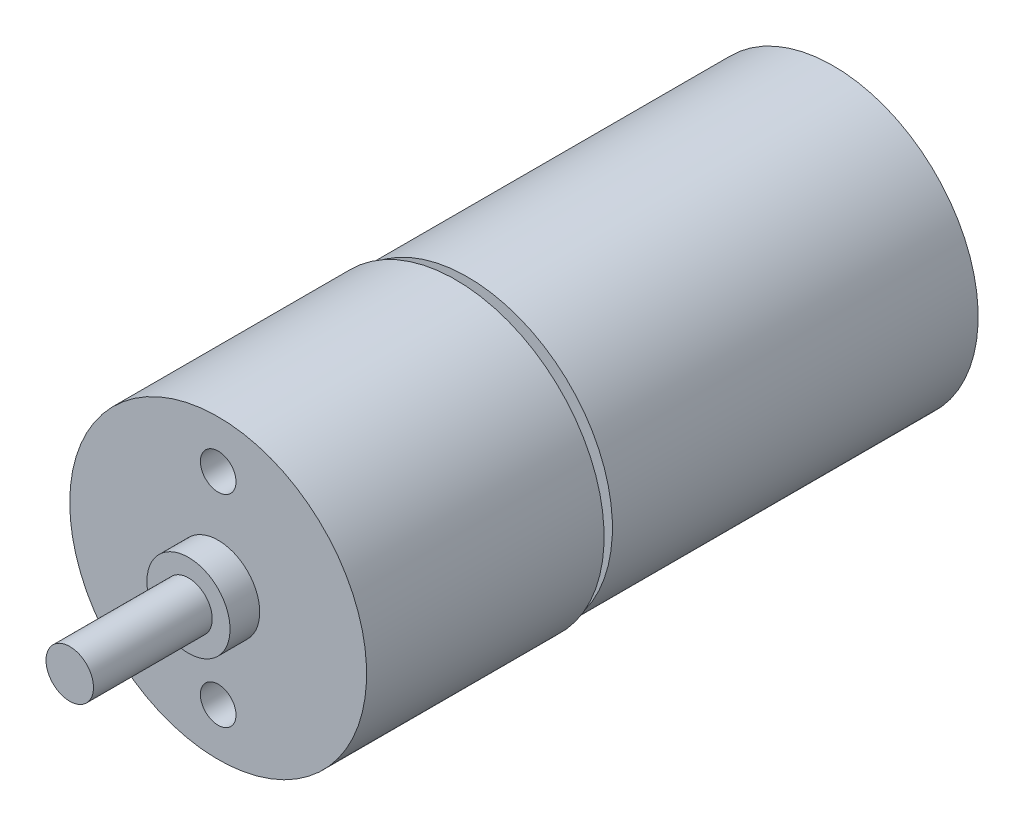
ISO-10303-21;
HEADER;
FILE_DESCRIPTION(('STEP AP214'),'2;1');
FILE_NAME('part.step','',(''),(''),'','','');
FILE_SCHEMA(('AUTOMOTIVE_DESIGN { 1 0 10303 214 1 1 1 1 }'));
ENDSEC;
DATA;
#1=APPLICATION_CONTEXT('core data for automotive mechanical design processes');
#2=APPLICATION_PROTOCOL_DEFINITION('international standard','automotive_design',2000,#1);
#3=PRODUCT_CONTEXT('',#1,'mechanical');
#4=PRODUCT('Part','Part','',(#3));
#5=PRODUCT_RELATED_PRODUCT_CATEGORY('part','',(#4));
#6=PRODUCT_DEFINITION_FORMATION('','',#4);
#7=PRODUCT_DEFINITION_CONTEXT('part definition',#1,'design');
#8=PRODUCT_DEFINITION('design','',#6,#7);
#9=PRODUCT_DEFINITION_SHAPE('','',#8);
#10=(LENGTH_UNIT() NAMED_UNIT(*) SI_UNIT(.MILLI.,.METRE.));
#11=(NAMED_UNIT(*) PLANE_ANGLE_UNIT() SI_UNIT($,.RADIAN.));
#12=(NAMED_UNIT(*) SI_UNIT($,.STERADIAN.) SOLID_ANGLE_UNIT());
#13=UNCERTAINTY_MEASURE_WITH_UNIT(LENGTH_MEASURE(1.E-05),#10,'distance_accuracy_value','');
#14=(GEOMETRIC_REPRESENTATION_CONTEXT(3) GLOBAL_UNCERTAINTY_ASSIGNED_CONTEXT((#13)) GLOBAL_UNIT_ASSIGNED_CONTEXT((#10,
#11,#12)) REPRESENTATION_CONTEXT('',''));
#15=CARTESIAN_POINT('',(0.,0.,0.));
#16=DIRECTION('',(0.,0.,1.));
#17=DIRECTION('',(1.,0.,0.));
#18=AXIS2_PLACEMENT_3D('',#15,#16,#17);
#19=CARTESIAN_POINT('',(0.,0.,64.3));
#20=DIRECTION('',(0.,0.,1.));
#21=DIRECTION('',(1.,0.,0.));
#22=AXIS2_PLACEMENT_3D('',#19,#20,#21);
#23=PLANE('',#22);
#24=CARTESIAN_POINT('',(0.,0.,64.3));
#25=DIRECTION('',(0.,0.,-1.));
#26=DIRECTION('',(-1.,0.,0.));
#27=AXIS2_PLACEMENT_3D('',#24,#25,#26);
#28=CIRCLE('',#27,2.);
#29=CARTESIAN_POINT('',(-2.,0.,64.3));
#30=VERTEX_POINT('',#29);
#31=EDGE_CURVE('E17',#30,#30,#28,.T.);
#32=ORIENTED_EDGE('',*,*,#31,.F.);
#33=EDGE_LOOP('',(#32));
#34=FACE_BOUND('',#33,.T.);
#35=ADVANCED_FACE('F14',(#34),#23,.T.);
#36=CARTESIAN_POINT('',(0.,0.,64.3));
#37=DIRECTION('',(0.,0.,-1.));
#38=DIRECTION('',(-1.,0.,0.));
#39=AXIS2_PLACEMENT_3D('',#36,#37,#38);
#40=CYLINDRICAL_SURFACE('',#39,2.);
#41=CARTESIAN_POINT('',(0.,0.,54.3));
#42=DIRECTION('',(0.,0.,-1.));
#43=DIRECTION('',(-1.,0.,0.));
#44=AXIS2_PLACEMENT_3D('',#41,#42,#43);
#45=CIRCLE('',#44,2.);
#46=CARTESIAN_POINT('',(-2.,0.,54.3));
#47=VERTEX_POINT('',#46);
#48=EDGE_CURVE('E57',#47,#47,#45,.T.);
#49=ORIENTED_EDGE('',*,*,#48,.F.);
#50=EDGE_LOOP('',(#49));
#51=FACE_BOUND('',#50,.T.);
#52=ORIENTED_EDGE('',*,*,#31,.T.);
#53=EDGE_LOOP('',(#52));
#54=FACE_BOUND('',#53,.T.);
#55=ADVANCED_FACE('F64',(#51,#54),#40,.T.);
#56=CARTESIAN_POINT('',(0.,8.5,39.8));
#57=DIRECTION('',(0.,0.,1.));
#58=DIRECTION('',(1.,0.,0.));
#59=AXIS2_PLACEMENT_3D('',#56,#57,#58);
#60=PLANE('',#59);
#61=CARTESIAN_POINT('',(0.,8.5,39.8));
#62=DIRECTION('',(0.,0.,1.));
#63=DIRECTION('',(1.,0.,0.));
#64=AXIS2_PLACEMENT_3D('',#61,#62,#63);
#65=CIRCLE('',#64,1.5);
#66=CARTESIAN_POINT('',(1.5,8.5,39.8));
#67=VERTEX_POINT('',#66);
#68=EDGE_CURVE('E55',#67,#67,#65,.T.);
#69=ORIENTED_EDGE('',*,*,#68,.T.);
#70=EDGE_LOOP('',(#69));
#71=FACE_BOUND('',#70,.T.);
#72=ADVANCED_FACE('F71',(#71),#60,.T.);
#73=CARTESIAN_POINT('',(0.,-8.5,39.8));
#74=DIRECTION('',(0.,0.,1.));
#75=DIRECTION('',(1.,0.,0.));
#76=AXIS2_PLACEMENT_3D('',#73,#74,#75);
#77=PLANE('',#76);
#78=CARTESIAN_POINT('',(0.,-8.5,39.8));
#79=DIRECTION('',(0.,0.,1.));
#80=DIRECTION('',(1.,0.,0.));
#81=AXIS2_PLACEMENT_3D('',#78,#79,#80);
#82=CIRCLE('',#81,1.5);
#83=CARTESIAN_POINT('',(1.5,-8.5,39.8));
#84=VERTEX_POINT('',#83);
#85=EDGE_CURVE('E52',#84,#84,#82,.T.);
#86=ORIENTED_EDGE('',*,*,#85,.T.);
#87=EDGE_LOOP('',(#86));
#88=FACE_BOUND('',#87,.T.);
#89=ADVANCED_FACE('F119',(#88),#77,.T.);
#90=CARTESIAN_POINT('',(0.,0.,54.3));
#91=DIRECTION('',(0.,0.,1.));
#92=DIRECTION('',(1.,0.,0.));
#93=AXIS2_PLACEMENT_3D('',#90,#91,#92);
#94=PLANE('',#93);
#95=ORIENTED_EDGE('',*,*,#48,.T.);
#96=EDGE_LOOP('',(#95));
#97=FACE_BOUND('',#96,.T.);
#98=CARTESIAN_POINT('',(0.,0.,54.3));
#99=DIRECTION('',(0.,0.,-1.));
#100=DIRECTION('',(-1.,0.,0.));
#101=AXIS2_PLACEMENT_3D('',#98,#99,#100);
#102=CIRCLE('',#101,3.5);
#103=CARTESIAN_POINT('',(-3.5,0.,54.3));
#104=VERTEX_POINT('',#103);
#105=EDGE_CURVE('E49',#104,#104,#102,.T.);
#106=ORIENTED_EDGE('',*,*,#105,.F.);
#107=EDGE_LOOP('',(#106));
#108=FACE_BOUND('',#107,.T.);
#109=ADVANCED_FACE('F115',(#97,#108),#94,.T.);
#110=CARTESIAN_POINT('',(0.,8.5,39.8));
#111=DIRECTION('',(0.,0.,1.));
#112=DIRECTION('',(1.,0.,0.));
#113=AXIS2_PLACEMENT_3D('',#110,#111,#112);
#114=CYLINDRICAL_SURFACE('',#113,1.5);
#115=CARTESIAN_POINT('',(0.,8.5,51.8));
#116=DIRECTION('',(0.,0.,1.));
#117=DIRECTION('',(1.,0.,0.));
#118=AXIS2_PLACEMENT_3D('',#115,#116,#117);
#119=CIRCLE('',#118,1.5);
#120=CARTESIAN_POINT('',(1.5,8.5,51.8));
#121=VERTEX_POINT('',#120);
#122=EDGE_CURVE('E46',#121,#121,#119,.F.);
#123=ORIENTED_EDGE('',*,*,#122,.F.);
#124=EDGE_LOOP('',(#123));
#125=FACE_BOUND('',#124,.T.);
#126=ORIENTED_EDGE('',*,*,#68,.F.);
#127=EDGE_LOOP('',(#126));
#128=FACE_BOUND('',#127,.T.);
#129=ADVANCED_FACE('F111',(#125,#128),#114,.F.);
#130=CARTESIAN_POINT('',(0.,-8.5,39.8));
#131=DIRECTION('',(0.,0.,1.));
#132=DIRECTION('',(1.,0.,0.));
#133=AXIS2_PLACEMENT_3D('',#130,#131,#132);
#134=CYLINDRICAL_SURFACE('',#133,1.5);
#135=CARTESIAN_POINT('',(0.,-8.5,51.8));
#136=DIRECTION('',(0.,0.,1.));
#137=DIRECTION('',(1.,0.,0.));
#138=AXIS2_PLACEMENT_3D('',#135,#136,#137);
#139=CIRCLE('',#138,1.5);
#140=CARTESIAN_POINT('',(1.5,-8.5,51.8));
#141=VERTEX_POINT('',#140);
#142=EDGE_CURVE('E43',#141,#141,#139,.F.);
#143=ORIENTED_EDGE('',*,*,#142,.F.);
#144=EDGE_LOOP('',(#143));
#145=FACE_BOUND('',#144,.T.);
#146=ORIENTED_EDGE('',*,*,#85,.F.);
#147=EDGE_LOOP('',(#146));
#148=FACE_BOUND('',#147,.T.);
#149=ADVANCED_FACE('F107',(#145,#148),#134,.F.);
#150=CARTESIAN_POINT('',(0.,0.,54.3));
#151=DIRECTION('',(0.,0.,-1.));
#152=DIRECTION('',(-1.,0.,0.));
#153=AXIS2_PLACEMENT_3D('',#150,#151,#152);
#154=CYLINDRICAL_SURFACE('',#153,3.5);
#155=CARTESIAN_POINT('',(0.,0.,51.8));
#156=DIRECTION('',(0.,0.,-1.));
#157=DIRECTION('',(-1.,0.,0.));
#158=AXIS2_PLACEMENT_3D('',#155,#156,#157);
#159=CIRCLE('',#158,3.5);
#160=CARTESIAN_POINT('',(-3.5,0.,51.8));
#161=VERTEX_POINT('',#160);
#162=EDGE_CURVE('E40',#161,#161,#159,.T.);
#163=ORIENTED_EDGE('',*,*,#162,.F.);
#164=EDGE_LOOP('',(#163));
#165=FACE_BOUND('',#164,.T.);
#166=ORIENTED_EDGE('',*,*,#105,.T.);
#167=EDGE_LOOP('',(#166));
#168=FACE_BOUND('',#167,.T.);
#169=ADVANCED_FACE('F103',(#165,#168),#154,.T.);
#170=CARTESIAN_POINT('',(0.,0.,51.8));
#171=DIRECTION('',(0.,0.,1.));
#172=DIRECTION('',(1.,0.,0.));
#173=AXIS2_PLACEMENT_3D('',#170,#171,#172);
#174=PLANE('',#173);
#175=ORIENTED_EDGE('',*,*,#162,.T.);
#176=EDGE_LOOP('',(#175));
#177=FACE_BOUND('',#176,.T.);
#178=ORIENTED_EDGE('',*,*,#142,.T.);
#179=EDGE_LOOP('',(#178));
#180=FACE_BOUND('',#179,.T.);
#181=ORIENTED_EDGE('',*,*,#122,.T.);
#182=EDGE_LOOP('',(#181));
#183=FACE_BOUND('',#182,.T.);
#184=CARTESIAN_POINT('',(0.,0.,51.8));
#185=DIRECTION('',(0.,0.,-1.));
#186=DIRECTION('',(-1.,0.,0.));
#187=AXIS2_PLACEMENT_3D('',#184,#185,#186);
#188=CIRCLE('',#187,12.5);
#189=CARTESIAN_POINT('',(-12.5,0.,51.8));
#190=VERTEX_POINT('',#189);
#191=EDGE_CURVE('E37',#190,#190,#188,.T.);
#192=ORIENTED_EDGE('',*,*,#191,.F.);
#193=EDGE_LOOP('',(#192));
#194=FACE_BOUND('',#193,.T.);
#195=ADVANCED_FACE('F99',(#177,#180,#183,#194),#174,.T.);
#196=CARTESIAN_POINT('',(0.,0.,51.8));
#197=DIRECTION('',(0.,0.,-1.));
#198=DIRECTION('',(-1.,0.,0.));
#199=AXIS2_PLACEMENT_3D('',#196,#197,#198);
#200=CYLINDRICAL_SURFACE('',#199,12.5);
#201=ORIENTED_EDGE('',*,*,#191,.T.);
#202=EDGE_LOOP('',(#201));
#203=FACE_BOUND('',#202,.T.);
#204=CARTESIAN_POINT('',(0.,0.,31.8));
#205=DIRECTION('',(0.,0.,-1.));
#206=DIRECTION('',(-1.,0.,0.));
#207=AXIS2_PLACEMENT_3D('',#204,#205,#206);
#208=CIRCLE('',#207,12.5);
#209=CARTESIAN_POINT('',(-12.5,0.,31.8));
#210=VERTEX_POINT('',#209);
#211=EDGE_CURVE('E34',#210,#210,#208,.F.);
#212=ORIENTED_EDGE('',*,*,#211,.T.);
#213=EDGE_LOOP('',(#212));
#214=FACE_BOUND('',#213,.T.);
#215=ADVANCED_FACE('F95',(#203,#214),#200,.T.);
#216=CARTESIAN_POINT('',(11.,0.,31.8));
#217=DIRECTION('',(0.,0.,1.));
#218=DIRECTION('',(1.,0.,0.));
#219=AXIS2_PLACEMENT_3D('',#216,#217,#218);
#220=PLANE('',#219);
#221=ORIENTED_EDGE('',*,*,#211,.F.);
#222=EDGE_LOOP('',(#221));
#223=FACE_BOUND('',#222,.T.);
#224=CARTESIAN_POINT('',(0.,0.,31.8));
#225=DIRECTION('',(0.,0.,1.));
#226=DIRECTION('',(1.,0.,0.));
#227=AXIS2_PLACEMENT_3D('',#224,#225,#226);
#228=CIRCLE('',#227,11.);
#229=CARTESIAN_POINT('',(11.,0.,31.8));
#230=VERTEX_POINT('',#229);
#231=EDGE_CURVE('E31',#230,#230,#228,.F.);
#232=ORIENTED_EDGE('',*,*,#231,.F.);
#233=EDGE_LOOP('',(#232));
#234=FACE_BOUND('',#233,.T.);
#235=ADVANCED_FACE('F91',(#223,#234),#220,.F.);
#236=CARTESIAN_POINT('',(0.,0.,51.8));
#237=DIRECTION('',(0.,0.,1.));
#238=DIRECTION('',(1.,0.,0.));
#239=AXIS2_PLACEMENT_3D('',#236,#237,#238);
#240=CYLINDRICAL_SURFACE('',#239,11.);
#241=ORIENTED_EDGE('',*,*,#231,.T.);
#242=EDGE_LOOP('',(#241));
#243=FACE_BOUND('',#242,.T.);
#244=CARTESIAN_POINT('',(0.,0.,30.8));
#245=DIRECTION('',(0.,0.,1.));
#246=DIRECTION('',(1.,0.,0.));
#247=AXIS2_PLACEMENT_3D('',#244,#245,#246);
#248=CIRCLE('',#247,11.);
#249=CARTESIAN_POINT('',(11.,0.,30.8));
#250=VERTEX_POINT('',#249);
#251=EDGE_CURVE('E26',#250,#250,#248,.T.);
#252=ORIENTED_EDGE('',*,*,#251,.T.);
#253=EDGE_LOOP('',(#252));
#254=FACE_BOUND('',#253,.T.);
#255=ADVANCED_FACE('F87',(#243,#254),#240,.T.);
#256=CARTESIAN_POINT('',(11.,0.,30.8));
#257=DIRECTION('',(0.,0.,-1.));
#258=DIRECTION('',(-1.,0.,0.));
#259=AXIS2_PLACEMENT_3D('',#256,#257,#258);
#260=PLANE('',#259);
#261=CARTESIAN_POINT('',(0.,0.,30.8));
#262=DIRECTION('',(0.,0.,-1.));
#263=DIRECTION('',(-1.,0.,0.));
#264=AXIS2_PLACEMENT_3D('',#261,#262,#263);
#265=CIRCLE('',#264,12.2);
#266=CARTESIAN_POINT('',(-12.2,0.,30.8));
#267=VERTEX_POINT('',#266);
#268=EDGE_CURVE('E21',#267,#267,#265,.T.);
#269=ORIENTED_EDGE('',*,*,#268,.F.);
#270=EDGE_LOOP('',(#269));
#271=FACE_BOUND('',#270,.T.);
#272=ORIENTED_EDGE('',*,*,#251,.F.);
#273=EDGE_LOOP('',(#272));
#274=FACE_BOUND('',#273,.T.);
#275=ADVANCED_FACE('F80',(#271,#274),#260,.F.);
#276=CARTESIAN_POINT('',(0.,0.,0.));
#277=DIRECTION('',(0.,0.,1.));
#278=DIRECTION('',(1.,0.,0.));
#279=AXIS2_PLACEMENT_3D('',#276,#277,#278);
#280=PLANE('',#279);
#281=CARTESIAN_POINT('',(0.,0.,0.));
#282=DIRECTION('',(0.,0.,-1.));
#283=DIRECTION('',(-1.,0.,0.));
#284=AXIS2_PLACEMENT_3D('',#281,#282,#283);
#285=CIRCLE('',#284,12.2);
#286=CARTESIAN_POINT('',(-12.2,0.,0.));
#287=VERTEX_POINT('',#286);
#288=EDGE_CURVE('E10',#287,#287,#285,.F.);
#289=ORIENTED_EDGE('',*,*,#288,.F.);
#290=EDGE_LOOP('',(#289));
#291=FACE_BOUND('',#290,.T.);
#292=ADVANCED_FACE('F75',(#291),#280,.F.);
#293=CARTESIAN_POINT('',(0.,0.,30.8));
#294=DIRECTION('',(0.,0.,-1.));
#295=DIRECTION('',(-1.,0.,0.));
#296=AXIS2_PLACEMENT_3D('',#293,#294,#295);
#297=CYLINDRICAL_SURFACE('',#296,12.2);
#298=ORIENTED_EDGE('',*,*,#288,.T.);
#299=EDGE_LOOP('',(#298));
#300=FACE_BOUND('',#299,.T.);
#301=ORIENTED_EDGE('',*,*,#268,.T.);
#302=EDGE_LOOP('',(#301));
#303=FACE_BOUND('',#302,.T.);
#304=ADVANCED_FACE('F73',(#300,#303),#297,.T.);
#305=CLOSED_SHELL('',(#35,#55,#72,#89,#109,#129,#149,#169,#195,#215,#235,#255,#275,#292,#304));
#306=MANIFOLD_SOLID_BREP('B1',#305);
#307=ADVANCED_BREP_SHAPE_REPRESENTATION('',(#18,#306),#14);
#308=SHAPE_DEFINITION_REPRESENTATION(#9,#307);
ENDSEC;
END-ISO-10303-21;
